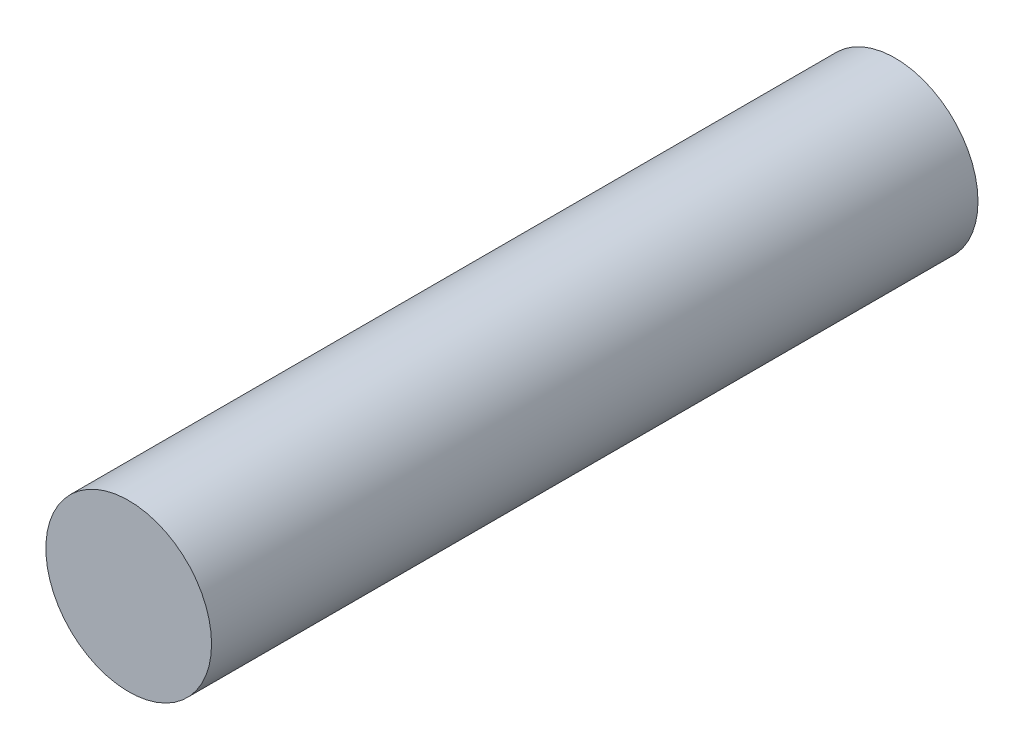
ISO-10303-21;
HEADER;
FILE_DESCRIPTION(('STEP AP214'),'2;1');
FILE_NAME('part.step','',(''),(''),'','','');
FILE_SCHEMA(('AUTOMOTIVE_DESIGN { 1 0 10303 214 1 1 1 1 }'));
ENDSEC;
DATA;
#1=APPLICATION_CONTEXT('core data for automotive mechanical design processes');
#2=APPLICATION_PROTOCOL_DEFINITION('international standard','automotive_design',2000,#1);
#3=PRODUCT_CONTEXT('',#1,'mechanical');
#4=PRODUCT('Part','Part','',(#3));
#5=PRODUCT_RELATED_PRODUCT_CATEGORY('part','',(#4));
#6=PRODUCT_DEFINITION_FORMATION('','',#4);
#7=PRODUCT_DEFINITION_CONTEXT('part definition',#1,'design');
#8=PRODUCT_DEFINITION('design','',#6,#7);
#9=PRODUCT_DEFINITION_SHAPE('','',#8);
#10=(LENGTH_UNIT() NAMED_UNIT(*) SI_UNIT(.MILLI.,.METRE.));
#11=(NAMED_UNIT(*) PLANE_ANGLE_UNIT() SI_UNIT($,.RADIAN.));
#12=(NAMED_UNIT(*) SI_UNIT($,.STERADIAN.) SOLID_ANGLE_UNIT());
#13=UNCERTAINTY_MEASURE_WITH_UNIT(LENGTH_MEASURE(1.E-05),#10,'distance_accuracy_value','');
#14=(GEOMETRIC_REPRESENTATION_CONTEXT(3) GLOBAL_UNCERTAINTY_ASSIGNED_CONTEXT((#13)) GLOBAL_UNIT_ASSIGNED_CONTEXT((#10,
#11,#12)) REPRESENTATION_CONTEXT('',''));
#15=CARTESIAN_POINT('',(0.,0.,0.));
#16=DIRECTION('',(0.,0.,1.));
#17=DIRECTION('',(1.,0.,0.));
#18=AXIS2_PLACEMENT_3D('',#15,#16,#17);
#19=CARTESIAN_POINT('',(0.,0.,37.));
#20=DIRECTION('',(0.,0.,-1.));
#21=DIRECTION('',(-1.,0.,0.));
#22=AXIS2_PLACEMENT_3D('',#19,#20,#21);
#23=CYLINDRICAL_SURFACE('',#22,4.);
#24=CARTESIAN_POINT('',(0.,0.,37.));
#25=DIRECTION('',(0.,0.,1.));
#26=DIRECTION('',(1.,0.,0.));
#27=AXIS2_PLACEMENT_3D('',#24,#25,#26);
#28=CIRCLE('',#27,4.);
#29=CARTESIAN_POINT('',(4.,0.,37.));
#30=VERTEX_POINT('',#29);
#31=EDGE_CURVE('E10',#30,#30,#28,.T.);
#32=ORIENTED_EDGE('',*,*,#31,.F.);
#33=EDGE_LOOP('',(#32));
#34=FACE_BOUND('',#33,.T.);
#35=CARTESIAN_POINT('',(0.,0.,0.));
#36=DIRECTION('',(0.,0.,1.));
#37=DIRECTION('',(1.,0.,0.));
#38=AXIS2_PLACEMENT_3D('',#35,#36,#37);
#39=CIRCLE('',#38,4.);
#40=CARTESIAN_POINT('',(4.,0.,0.));
#41=VERTEX_POINT('',#40);
#42=EDGE_CURVE('E37',#41,#41,#39,.T.);
#43=ORIENTED_EDGE('',*,*,#42,.T.);
#44=EDGE_LOOP('',(#43));
#45=FACE_BOUND('',#44,.T.);
#46=ADVANCED_FACE('F34',(#34,#45),#23,.T.);
#47=CARTESIAN_POINT('',(0.,0.,37.));
#48=DIRECTION('',(0.,0.,1.));
#49=DIRECTION('',(1.,0.,0.));
#50=AXIS2_PLACEMENT_3D('',#47,#48,#49);
#51=PLANE('',#50);
#52=ORIENTED_EDGE('',*,*,#31,.T.);
#53=EDGE_LOOP('',(#52));
#54=FACE_BOUND('',#53,.T.);
#55=ADVANCED_FACE('F49',(#54),#51,.T.);
#56=CARTESIAN_POINT('',(0.,0.,0.));
#57=DIRECTION('',(0.,0.,1.));
#58=DIRECTION('',(1.,0.,0.));
#59=AXIS2_PLACEMENT_3D('',#56,#57,#58);
#60=PLANE('',#59);
#61=ORIENTED_EDGE('',*,*,#42,.F.);
#62=EDGE_LOOP('',(#61));
#63=FACE_BOUND('',#62,.T.);
#64=ADVANCED_FACE('F47',(#63),#60,.F.);
#65=CLOSED_SHELL('',(#46,#55,#64));
#66=MANIFOLD_SOLID_BREP('B2',#65);
#67=ADVANCED_BREP_SHAPE_REPRESENTATION('',(#18,#66),#14);
#68=SHAPE_DEFINITION_REPRESENTATION(#9,#67);
ENDSEC;
END-ISO-10303-21;
